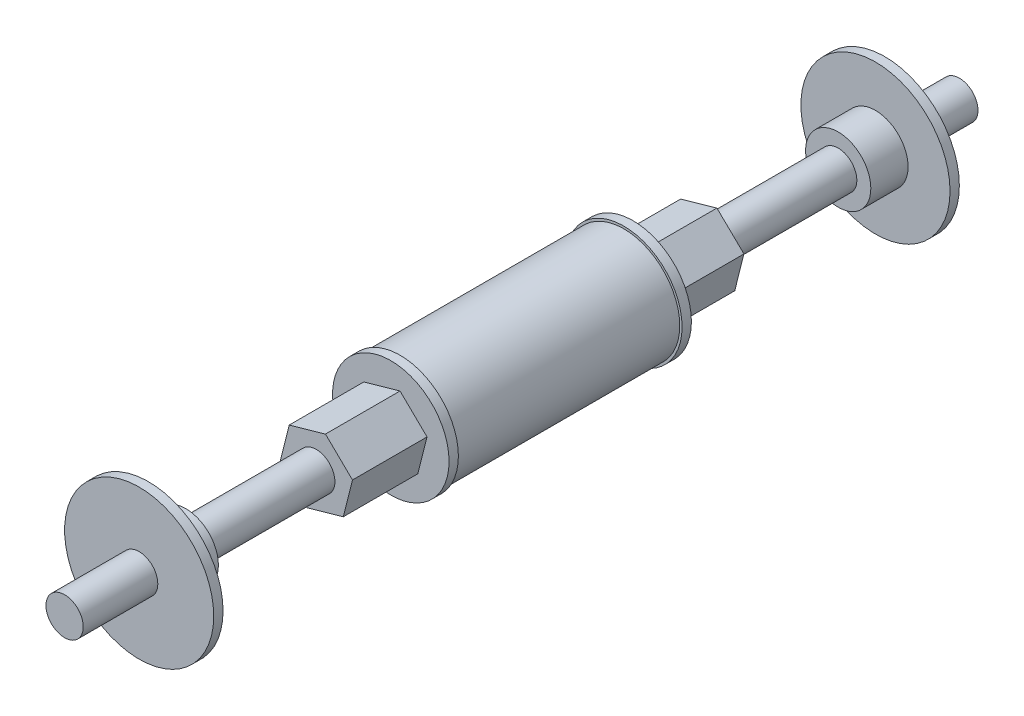
ISO-10303-21;
HEADER;
FILE_DESCRIPTION(('STEP AP214'),'2;1');
FILE_NAME('part.step','',(''),(''),'','','');
FILE_SCHEMA(('AUTOMOTIVE_DESIGN { 1 0 10303 214 1 1 1 1 }'));
ENDSEC;
DATA;
#1=APPLICATION_CONTEXT('core data for automotive mechanical design processes');
#2=APPLICATION_PROTOCOL_DEFINITION('international standard','automotive_design',2000,#1);
#3=PRODUCT_CONTEXT('',#1,'mechanical');
#4=PRODUCT('Part','Part','',(#3));
#5=PRODUCT_RELATED_PRODUCT_CATEGORY('part','',(#4));
#6=PRODUCT_DEFINITION_FORMATION('','',#4);
#7=PRODUCT_DEFINITION_CONTEXT('part definition',#1,'design');
#8=PRODUCT_DEFINITION('design','',#6,#7);
#9=PRODUCT_DEFINITION_SHAPE('','',#8);
#10=(LENGTH_UNIT() NAMED_UNIT(*) SI_UNIT(.MILLI.,.METRE.));
#11=(NAMED_UNIT(*) PLANE_ANGLE_UNIT() SI_UNIT($,.RADIAN.));
#12=(NAMED_UNIT(*) SI_UNIT($,.STERADIAN.) SOLID_ANGLE_UNIT());
#13=UNCERTAINTY_MEASURE_WITH_UNIT(LENGTH_MEASURE(1.E-05),#10,'distance_accuracy_value','');
#14=(GEOMETRIC_REPRESENTATION_CONTEXT(3) GLOBAL_UNCERTAINTY_ASSIGNED_CONTEXT((#13)) GLOBAL_UNIT_ASSIGNED_CONTEXT((#10,
#11,#12)) REPRESENTATION_CONTEXT('',''));
#15=CARTESIAN_POINT('',(0.,0.,0.));
#16=DIRECTION('',(0.,0.,1.));
#17=DIRECTION('',(1.,0.,0.));
#18=AXIS2_PLACEMENT_3D('',#15,#16,#17);
#19=CARTESIAN_POINT('',(0.,0.,-20.6375));
#20=DIRECTION('',(0.,0.,-1.));
#21=DIRECTION('',(1.,0.,0.));
#22=AXIS2_PLACEMENT_3D('',#19,#20,#21);
#23=PLANE('',#22);
#24=CARTESIAN_POINT('',(0.,0.,-20.6375));
#25=DIRECTION('',(0.,0.,1.));
#26=DIRECTION('',(1.,0.,0.));
#27=AXIS2_PLACEMENT_3D('',#24,#25,#26);
#28=CIRCLE('',#27,9.921875);
#29=CARTESIAN_POINT('',(9.921875,0.,-20.6375));
#30=VERTEX_POINT('',#29);
#31=EDGE_CURVE('E209',#30,#30,#28,.T.);
#32=ORIENTED_EDGE('',*,*,#31,.F.);
#33=EDGE_LOOP('',(#32));
#34=FACE_BOUND('',#33,.T.);
#35=DIRECTION('',(0.717469018062941,-0.696590416327844,0.));
#36=VECTOR('',#35,1.);
#37=CARTESIAN_POINT('',(-6.17200110950044,-1.75184314014087,-20.6375));
#38=LINE('',#37,#36);
#39=CARTESIAN_POINT('',(-6.17200110950044,-1.75184314014087,-20.6375));
#40=VERTEX_POINT('',#39);
#41=CARTESIAN_POINT('',(-1.56885989194273,-6.22103132308356,-20.6375));
#42=VERTEX_POINT('',#41);
#43=EDGE_CURVE('E177',#40,#42,#38,.T.);
#44=ORIENTED_EDGE('',*,*,#43,.T.);
#45=DIRECTION('',(0.961999505604162,0.273051187906861,0.));
#46=VECTOR('',#45,1.);
#47=CARTESIAN_POINT('',(-1.56885989194273,-6.22103132308356,-20.6375));
#48=LINE('',#47,#46);
#49=CARTESIAN_POINT('',(4.60314121755772,-4.46918818294269,-20.6375));
#50=VERTEX_POINT('',#49);
#51=EDGE_CURVE('E59',#42,#50,#48,.T.);
#52=ORIENTED_EDGE('',*,*,#51,.T.);
#53=DIRECTION('',(0.244530487541221,0.969641604234705,0.));
#54=VECTOR('',#53,1.);
#55=CARTESIAN_POINT('',(4.60314121755772,-4.46918818294269,-20.6375));
#56=LINE('',#55,#54);
#57=CARTESIAN_POINT('',(6.17200110950044,1.75184314014087,-20.6375));
#58=VERTEX_POINT('',#57);
#59=EDGE_CURVE('E154',#50,#58,#56,.T.);
#60=ORIENTED_EDGE('',*,*,#59,.T.);
#61=DIRECTION('',(-0.717469018062941,0.696590416327844,0.));
#62=VECTOR('',#61,1.);
#63=CARTESIAN_POINT('',(6.17200110950044,1.75184314014087,-20.6375));
#64=LINE('',#63,#62);
#65=CARTESIAN_POINT('',(1.56885989194273,6.22103132308356,-20.6375));
#66=VERTEX_POINT('',#65);
#67=EDGE_CURVE('E189',#58,#66,#64,.T.);
#68=ORIENTED_EDGE('',*,*,#67,.T.);
#69=DIRECTION('',(-0.961999505604162,-0.273051187906861,0.));
#70=VECTOR('',#69,1.);
#71=CARTESIAN_POINT('',(1.56885989194273,6.22103132308356,-20.6375));
#72=LINE('',#71,#70);
#73=CARTESIAN_POINT('',(-4.60314121755772,4.46918818294269,-20.6375));
#74=VERTEX_POINT('',#73);
#75=EDGE_CURVE('E185',#66,#74,#72,.T.);
#76=ORIENTED_EDGE('',*,*,#75,.T.);
#77=DIRECTION('',(-0.244530487541221,-0.969641604234705,0.));
#78=VECTOR('',#77,1.);
#79=CARTESIAN_POINT('',(-4.60314121755772,4.46918818294269,-20.6375));
#80=LINE('',#79,#78);
#81=EDGE_CURVE('E181',#74,#40,#80,.T.);
#82=ORIENTED_EDGE('',*,*,#81,.T.);
#83=EDGE_LOOP('',(#44,#52,#60,#68,#76,#82));
#84=FACE_BOUND('',#83,.T.);
#85=ADVANCED_FACE('F41',(#34,#84),#23,.T.);
#86=CARTESIAN_POINT('',(0.,0.,19.05));
#87=DIRECTION('',(0.,0.,-1.));
#88=DIRECTION('',(-1.,0.,0.));
#89=AXIS2_PLACEMENT_3D('',#86,#87,#88);
#90=CYLINDRICAL_SURFACE('',#89,9.525);
#91=CARTESIAN_POINT('',(0.,0.,19.05));
#92=DIRECTION('',(0.,0.,1.));
#93=DIRECTION('',(1.,0.,0.));
#94=AXIS2_PLACEMENT_3D('',#91,#92,#93);
#95=CIRCLE('',#94,9.525);
#96=CARTESIAN_POINT('',(9.525,0.,19.05));
#97=VERTEX_POINT('',#96);
#98=EDGE_CURVE('E45',#97,#97,#95,.T.);
#99=ORIENTED_EDGE('',*,*,#98,.F.);
#100=EDGE_LOOP('',(#99));
#101=FACE_BOUND('',#100,.T.);
#102=CARTESIAN_POINT('',(0.,0.,-19.05));
#103=DIRECTION('',(0.,0.,1.));
#104=DIRECTION('',(1.,0.,0.));
#105=AXIS2_PLACEMENT_3D('',#102,#103,#104);
#106=CIRCLE('',#105,9.525);
#107=CARTESIAN_POINT('',(9.525,0.,-19.05));
#108=VERTEX_POINT('',#107);
#109=EDGE_CURVE('E213',#108,#108,#106,.T.);
#110=ORIENTED_EDGE('',*,*,#109,.T.);
#111=EDGE_LOOP('',(#110));
#112=FACE_BOUND('',#111,.T.);
#113=ADVANCED_FACE('F43',(#101,#112),#90,.T.);
#114=CARTESIAN_POINT('',(0.,0.,20.6375));
#115=DIRECTION('',(0.,0.,-1.));
#116=DIRECTION('',(-1.,0.,0.));
#117=AXIS2_PLACEMENT_3D('',#114,#115,#116);
#118=CYLINDRICAL_SURFACE('',#117,9.921875);
#119=CARTESIAN_POINT('',(0.,0.,20.6375));
#120=DIRECTION('',(0.,0.,1.));
#121=DIRECTION('',(1.,0.,0.));
#122=AXIS2_PLACEMENT_3D('',#119,#120,#121);
#123=CIRCLE('',#122,9.921875);
#124=CARTESIAN_POINT('',(9.921875,0.,20.6375));
#125=VERTEX_POINT('',#124);
#126=EDGE_CURVE('E312',#125,#125,#123,.T.);
#127=ORIENTED_EDGE('',*,*,#126,.F.);
#128=EDGE_LOOP('',(#127));
#129=FACE_BOUND('',#128,.T.);
#130=CARTESIAN_POINT('',(0.,0.,19.05));
#131=DIRECTION('',(0.,0.,1.));
#132=DIRECTION('',(1.,0.,0.));
#133=AXIS2_PLACEMENT_3D('',#130,#131,#132);
#134=CIRCLE('',#133,9.921875);
#135=CARTESIAN_POINT('',(9.921875,0.,19.05));
#136=VERTEX_POINT('',#135);
#137=EDGE_CURVE('E311',#136,#136,#134,.T.);
#138=ORIENTED_EDGE('',*,*,#137,.T.);
#139=EDGE_LOOP('',(#138));
#140=FACE_BOUND('',#139,.T.);
#141=ADVANCED_FACE('F319',(#129,#140),#118,.T.);
#142=CARTESIAN_POINT('',(0.,0.,20.6375));
#143=DIRECTION('',(0.,0.,1.));
#144=DIRECTION('',(1.,0.,0.));
#145=AXIS2_PLACEMENT_3D('',#142,#143,#144);
#146=PLANE('',#145);
#147=DIRECTION('',(0.961999505604162,0.273051187906861,0.));
#148=VECTOR('',#147,1.);
#149=CARTESIAN_POINT('',(-1.56885989194273,-6.22103132308356,20.6375));
#150=LINE('',#149,#148);
#151=CARTESIAN_POINT('',(-1.56885989194273,-6.22103132308356,20.6375));
#152=VERTEX_POINT('',#151);
#153=CARTESIAN_POINT('',(4.60314121755772,-4.46918818294269,20.6375));
#154=VERTEX_POINT('',#153);
#155=EDGE_CURVE('E67',#152,#154,#150,.T.);
#156=ORIENTED_EDGE('',*,*,#155,.F.);
#157=DIRECTION('',(0.717469018062941,-0.696590416327844,0.));
#158=VECTOR('',#157,1.);
#159=CARTESIAN_POINT('',(-6.17200110950044,-1.75184314014087,20.6375));
#160=LINE('',#159,#158);
#161=CARTESIAN_POINT('',(-6.17200110950044,-1.75184314014087,20.6375));
#162=VERTEX_POINT('',#161);
#163=EDGE_CURVE('E252',#162,#152,#160,.T.);
#164=ORIENTED_EDGE('',*,*,#163,.F.);
#165=DIRECTION('',(-0.244530487541221,-0.969641604234705,0.));
#166=VECTOR('',#165,1.);
#167=CARTESIAN_POINT('',(-4.60314121755772,4.46918818294269,20.6375));
#168=LINE('',#167,#166);
#169=CARTESIAN_POINT('',(-4.60314121755772,4.46918818294269,20.6375));
#170=VERTEX_POINT('',#169);
#171=EDGE_CURVE('E282',#170,#162,#168,.T.);
#172=ORIENTED_EDGE('',*,*,#171,.F.);
#173=DIRECTION('',(-0.961999505604162,-0.273051187906861,0.));
#174=VECTOR('',#173,1.);
#175=CARTESIAN_POINT('',(1.56885989194273,6.22103132308356,20.6375));
#176=LINE('',#175,#174);
#177=CARTESIAN_POINT('',(1.56885989194273,6.22103132308356,20.6375));
#178=VERTEX_POINT('',#177);
#179=EDGE_CURVE('E278',#178,#170,#176,.T.);
#180=ORIENTED_EDGE('',*,*,#179,.F.);
#181=DIRECTION('',(-0.717469018062941,0.696590416327844,0.));
#182=VECTOR('',#181,1.);
#183=CARTESIAN_POINT('',(6.17200110950044,1.75184314014087,20.6375));
#184=LINE('',#183,#182);
#185=CARTESIAN_POINT('',(6.17200110950044,1.75184314014087,20.6375));
#186=VERTEX_POINT('',#185);
#187=EDGE_CURVE('E274',#186,#178,#184,.T.);
#188=ORIENTED_EDGE('',*,*,#187,.F.);
#189=DIRECTION('',(0.244530487541221,0.969641604234705,0.));
#190=VECTOR('',#189,1.);
#191=CARTESIAN_POINT('',(4.60314121755772,-4.46918818294269,20.6375));
#192=LINE('',#191,#190);
#193=EDGE_CURVE('E270',#154,#186,#192,.T.);
#194=ORIENTED_EDGE('',*,*,#193,.F.);
#195=EDGE_LOOP('',(#156,#164,#172,#180,#188,#194));
#196=FACE_BOUND('',#195,.T.);
#197=ORIENTED_EDGE('',*,*,#126,.T.);
#198=EDGE_LOOP('',(#197));
#199=FACE_BOUND('',#198,.T.);
#200=ADVANCED_FACE('F324',(#196,#199),#146,.T.);
#201=CARTESIAN_POINT('',(0.,0.,19.05));
#202=DIRECTION('',(0.,0.,1.));
#203=DIRECTION('',(1.,0.,0.));
#204=AXIS2_PLACEMENT_3D('',#201,#202,#203);
#205=PLANE('',#204);
#206=ORIENTED_EDGE('',*,*,#98,.T.);
#207=EDGE_LOOP('',(#206));
#208=FACE_BOUND('',#207,.T.);
#209=ORIENTED_EDGE('',*,*,#137,.F.);
#210=EDGE_LOOP('',(#209));
#211=FACE_BOUND('',#210,.T.);
#212=ADVANCED_FACE('F321',(#208,#211),#205,.F.);
#213=CARTESIAN_POINT('',(-1.56885989194273,-6.22103132308356,33.3375));
#214=DIRECTION('',(-0.273051187906861,0.961999505604162,0.));
#215=DIRECTION('',(-0.961999505604162,-0.273051187906861,0.));
#216=AXIS2_PLACEMENT_3D('',#213,#214,#215);
#217=PLANE('',#216);
#218=ORIENTED_EDGE('',*,*,#155,.T.);
#219=DIRECTION('',(0.,0.,-1.));
#220=VECTOR('',#219,1.);
#221=CARTESIAN_POINT('',(4.60314121755772,-4.46918818294269,33.3375));
#222=LINE('',#221,#220);
#223=CARTESIAN_POINT('',(4.60314121755772,-4.46918818294269,33.3375));
#224=VERTEX_POINT('',#223);
#225=EDGE_CURVE('E307',#224,#154,#222,.T.);
#226=ORIENTED_EDGE('',*,*,#225,.F.);
#227=DIRECTION('',(0.961999505604162,0.273051187906861,0.));
#228=VECTOR('',#227,1.);
#229=CARTESIAN_POINT('',(-1.56885989194273,-6.22103132308356,33.3375));
#230=LINE('',#229,#228);
#231=CARTESIAN_POINT('',(-1.56885989194273,-6.22103132308356,33.3375));
#232=VERTEX_POINT('',#231);
#233=EDGE_CURVE('E247',#232,#224,#230,.T.);
#234=ORIENTED_EDGE('',*,*,#233,.F.);
#235=DIRECTION('',(0.,0.,-1.));
#236=VECTOR('',#235,1.);
#237=CARTESIAN_POINT('',(-1.56885989194273,-6.22103132308356,33.3375));
#238=LINE('',#237,#236);
#239=EDGE_CURVE('E267',#232,#152,#238,.T.);
#240=ORIENTED_EDGE('',*,*,#239,.T.);
#241=EDGE_LOOP('',(#218,#226,#234,#240));
#242=FACE_BOUND('',#241,.T.);
#243=ADVANCED_FACE('F323',(#242),#217,.F.);
#244=CARTESIAN_POINT('',(4.60314121755772,-4.46918818294269,33.3375));
#245=DIRECTION('',(-0.969641604234705,0.244530487541221,0.));
#246=DIRECTION('',(-0.244530487541221,-0.969641604234705,0.));
#247=AXIS2_PLACEMENT_3D('',#244,#245,#246);
#248=PLANE('',#247);
#249=ORIENTED_EDGE('',*,*,#193,.T.);
#250=DIRECTION('',(0.,0.,-1.));
#251=VECTOR('',#250,1.);
#252=CARTESIAN_POINT('',(6.17200110950044,1.75184314014087,33.3375));
#253=LINE('',#252,#251);
#254=CARTESIAN_POINT('',(6.17200110950044,1.75184314014087,33.3375));
#255=VERTEX_POINT('',#254);
#256=EDGE_CURVE('E303',#255,#186,#253,.T.);
#257=ORIENTED_EDGE('',*,*,#256,.F.);
#258=DIRECTION('',(0.244530487541221,0.969641604234705,0.));
#259=VECTOR('',#258,1.);
#260=CARTESIAN_POINT('',(4.60314121755772,-4.46918818294269,33.3375));
#261=LINE('',#260,#259);
#262=EDGE_CURVE('E251',#224,#255,#261,.T.);
#263=ORIENTED_EDGE('',*,*,#262,.F.);
#264=ORIENTED_EDGE('',*,*,#225,.T.);
#265=EDGE_LOOP('',(#249,#257,#263,#264));
#266=FACE_BOUND('',#265,.T.);
#267=ADVANCED_FACE('F331',(#266),#248,.F.);
#268=CARTESIAN_POINT('',(6.17200110950044,1.75184314014087,33.3375));
#269=DIRECTION('',(-0.696590416327844,-0.717469018062941,0.));
#270=DIRECTION('',(0.717469018062941,-0.696590416327844,0.));
#271=AXIS2_PLACEMENT_3D('',#268,#269,#270);
#272=PLANE('',#271);
#273=ORIENTED_EDGE('',*,*,#187,.T.);
#274=DIRECTION('',(0.,0.,-1.));
#275=VECTOR('',#274,1.);
#276=CARTESIAN_POINT('',(1.56885989194273,6.22103132308356,33.3375));
#277=LINE('',#276,#275);
#278=CARTESIAN_POINT('',(1.56885989194273,6.22103132308356,33.3375));
#279=VERTEX_POINT('',#278);
#280=EDGE_CURVE('E299',#279,#178,#277,.T.);
#281=ORIENTED_EDGE('',*,*,#280,.F.);
#282=DIRECTION('',(-0.717469018062941,0.696590416327844,0.));
#283=VECTOR('',#282,1.);
#284=CARTESIAN_POINT('',(6.17200110950044,1.75184314014087,33.3375));
#285=LINE('',#284,#283);
#286=EDGE_CURVE('E255',#255,#279,#285,.T.);
#287=ORIENTED_EDGE('',*,*,#286,.F.);
#288=ORIENTED_EDGE('',*,*,#256,.T.);
#289=EDGE_LOOP('',(#273,#281,#287,#288));
#290=FACE_BOUND('',#289,.T.);
#291=ADVANCED_FACE('F403',(#290),#272,.F.);
#292=CARTESIAN_POINT('',(1.56885989194273,6.22103132308356,33.3375));
#293=DIRECTION('',(0.273051187906861,-0.961999505604162,0.));
#294=DIRECTION('',(0.961999505604162,0.273051187906861,0.));
#295=AXIS2_PLACEMENT_3D('',#292,#293,#294);
#296=PLANE('',#295);
#297=ORIENTED_EDGE('',*,*,#179,.T.);
#298=DIRECTION('',(0.,0.,-1.));
#299=VECTOR('',#298,1.);
#300=CARTESIAN_POINT('',(-4.60314121755772,4.46918818294269,33.3375));
#301=LINE('',#300,#299);
#302=CARTESIAN_POINT('',(-4.60314121755772,4.46918818294269,33.3375));
#303=VERTEX_POINT('',#302);
#304=EDGE_CURVE('E295',#303,#170,#301,.T.);
#305=ORIENTED_EDGE('',*,*,#304,.F.);
#306=DIRECTION('',(-0.961999505604162,-0.273051187906861,0.));
#307=VECTOR('',#306,1.);
#308=CARTESIAN_POINT('',(1.56885989194273,6.22103132308356,33.3375));
#309=LINE('',#308,#307);
#310=EDGE_CURVE('E258',#279,#303,#309,.T.);
#311=ORIENTED_EDGE('',*,*,#310,.F.);
#312=ORIENTED_EDGE('',*,*,#280,.T.);
#313=EDGE_LOOP('',(#297,#305,#311,#312));
#314=FACE_BOUND('',#313,.T.);
#315=ADVANCED_FACE('F399',(#314),#296,.F.);
#316=CARTESIAN_POINT('',(-4.60314121755772,4.46918818294269,33.3375));
#317=DIRECTION('',(0.969641604234705,-0.244530487541221,0.));
#318=DIRECTION('',(0.244530487541221,0.969641604234705,0.));
#319=AXIS2_PLACEMENT_3D('',#316,#317,#318);
#320=PLANE('',#319);
#321=ORIENTED_EDGE('',*,*,#171,.T.);
#322=DIRECTION('',(0.,0.,-1.));
#323=VECTOR('',#322,1.);
#324=CARTESIAN_POINT('',(-6.17200110950044,-1.75184314014087,33.3375));
#325=LINE('',#324,#323);
#326=CARTESIAN_POINT('',(-6.17200110950044,-1.75184314014087,33.3375));
#327=VERTEX_POINT('',#326);
#328=EDGE_CURVE('E291',#327,#162,#325,.T.);
#329=ORIENTED_EDGE('',*,*,#328,.F.);
#330=DIRECTION('',(-0.244530487541221,-0.969641604234705,0.));
#331=VECTOR('',#330,1.);
#332=CARTESIAN_POINT('',(-4.60314121755772,4.46918818294269,33.3375));
#333=LINE('',#332,#331);
#334=EDGE_CURVE('E261',#303,#327,#333,.T.);
#335=ORIENTED_EDGE('',*,*,#334,.F.);
#336=ORIENTED_EDGE('',*,*,#304,.T.);
#337=EDGE_LOOP('',(#321,#329,#335,#336));
#338=FACE_BOUND('',#337,.T.);
#339=ADVANCED_FACE('F395',(#338),#320,.F.);
#340=CARTESIAN_POINT('',(-6.17200110950044,-1.75184314014087,33.3375));
#341=DIRECTION('',(0.696590416327844,0.717469018062941,0.));
#342=DIRECTION('',(-0.717469018062941,0.696590416327844,0.));
#343=AXIS2_PLACEMENT_3D('',#340,#341,#342);
#344=PLANE('',#343);
#345=ORIENTED_EDGE('',*,*,#163,.T.);
#346=ORIENTED_EDGE('',*,*,#239,.F.);
#347=DIRECTION('',(0.717469018062941,-0.696590416327844,0.));
#348=VECTOR('',#347,1.);
#349=CARTESIAN_POINT('',(-6.17200110950044,-1.75184314014087,33.3375));
#350=LINE('',#349,#348);
#351=EDGE_CURVE('E264',#327,#232,#350,.T.);
#352=ORIENTED_EDGE('',*,*,#351,.F.);
#353=ORIENTED_EDGE('',*,*,#328,.T.);
#354=EDGE_LOOP('',(#345,#346,#352,#353));
#355=FACE_BOUND('',#354,.T.);
#356=ADVANCED_FACE('F391',(#355),#344,.F.);
#357=CARTESIAN_POINT('',(0.,0.,33.3375));
#358=DIRECTION('',(0.,0.,1.));
#359=DIRECTION('',(1.,0.,0.));
#360=AXIS2_PLACEMENT_3D('',#357,#358,#359);
#361=PLANE('',#360);
#362=CARTESIAN_POINT('',(0.,0.,33.3375));
#363=DIRECTION('',(0.,0.,1.));
#364=DIRECTION('',(1.,0.,0.));
#365=AXIS2_PLACEMENT_3D('',#362,#363,#364);
#366=CIRCLE('',#365,3.175);
#367=CARTESIAN_POINT('',(3.175,0.,33.3375));
#368=VERTEX_POINT('',#367);
#369=EDGE_CURVE('E51',#368,#368,#366,.T.);
#370=ORIENTED_EDGE('',*,*,#369,.F.);
#371=EDGE_LOOP('',(#370));
#372=FACE_BOUND('',#371,.T.);
#373=ORIENTED_EDGE('',*,*,#233,.T.);
#374=ORIENTED_EDGE('',*,*,#262,.T.);
#375=ORIENTED_EDGE('',*,*,#286,.T.);
#376=ORIENTED_EDGE('',*,*,#310,.T.);
#377=ORIENTED_EDGE('',*,*,#334,.T.);
#378=ORIENTED_EDGE('',*,*,#351,.T.);
#379=EDGE_LOOP('',(#373,#374,#375,#376,#377,#378));
#380=FACE_BOUND('',#379,.T.);
#381=ADVANCED_FACE('F387',(#372,#380),#361,.T.);
#382=CARTESIAN_POINT('',(0.,0.,55.5625));
#383=DIRECTION('',(0.,0.,-1.));
#384=DIRECTION('',(-1.,0.,0.));
#385=AXIS2_PLACEMENT_3D('',#382,#383,#384);
#386=CYLINDRICAL_SURFACE('',#385,3.175);
#387=CARTESIAN_POINT('',(0.,0.,55.5625));
#388=DIRECTION('',(0.,0.,1.));
#389=DIRECTION('',(1.,0.,0.));
#390=AXIS2_PLACEMENT_3D('',#387,#388,#389);
#391=CIRCLE('',#390,3.175);
#392=CARTESIAN_POINT('',(3.175,0.,55.5625));
#393=VERTEX_POINT('',#392);
#394=EDGE_CURVE('E237',#393,#393,#391,.T.);
#395=ORIENTED_EDGE('',*,*,#394,.F.);
#396=EDGE_LOOP('',(#395));
#397=FACE_BOUND('',#396,.T.);
#398=ORIENTED_EDGE('',*,*,#369,.T.);
#399=EDGE_LOOP('',(#398));
#400=FACE_BOUND('',#399,.T.);
#401=ADVANCED_FACE('F383',(#397,#400),#386,.T.);
#402=CARTESIAN_POINT('',(0.,0.,61.9125));
#403=DIRECTION('',(0.,0.,-1.));
#404=DIRECTION('',(-1.,0.,0.));
#405=AXIS2_PLACEMENT_3D('',#402,#403,#404);
#406=CYLINDRICAL_SURFACE('',#405,5.55625);
#407=CARTESIAN_POINT('',(0.,0.,61.9125));
#408=DIRECTION('',(0.,0.,1.));
#409=DIRECTION('',(1.,0.,0.));
#410=AXIS2_PLACEMENT_3D('',#407,#408,#409);
#411=CIRCLE('',#410,5.55625);
#412=CARTESIAN_POINT('',(5.55625,0.,61.9125));
#413=VERTEX_POINT('',#412);
#414=EDGE_CURVE('E233',#413,#413,#411,.T.);
#415=ORIENTED_EDGE('',*,*,#414,.F.);
#416=EDGE_LOOP('',(#415));
#417=FACE_BOUND('',#416,.T.);
#418=CARTESIAN_POINT('',(0.,0.,55.5625));
#419=DIRECTION('',(0.,0.,1.));
#420=DIRECTION('',(1.,0.,0.));
#421=AXIS2_PLACEMENT_3D('',#418,#419,#420);
#422=CIRCLE('',#421,5.55625);
#423=CARTESIAN_POINT('',(5.55625,0.,55.5625));
#424=VERTEX_POINT('',#423);
#425=EDGE_CURVE('E229',#424,#424,#422,.T.);
#426=ORIENTED_EDGE('',*,*,#425,.T.);
#427=EDGE_LOOP('',(#426));
#428=FACE_BOUND('',#427,.T.);
#429=ADVANCED_FACE('F379',(#417,#428),#406,.T.);
#430=CARTESIAN_POINT('',(0.,0.,55.5625));
#431=DIRECTION('',(0.,0.,1.));
#432=DIRECTION('',(1.,0.,0.));
#433=AXIS2_PLACEMENT_3D('',#430,#431,#432);
#434=PLANE('',#433);
#435=ORIENTED_EDGE('',*,*,#394,.T.);
#436=EDGE_LOOP('',(#435));
#437=FACE_BOUND('',#436,.T.);
#438=ORIENTED_EDGE('',*,*,#425,.F.);
#439=EDGE_LOOP('',(#438));
#440=FACE_BOUND('',#439,.T.);
#441=ADVANCED_FACE('F375',(#437,#440),#434,.F.);
#442=CARTESIAN_POINT('',(0.,0.,63.5));
#443=DIRECTION('',(0.,0.,-1.));
#444=DIRECTION('',(-1.,0.,0.));
#445=AXIS2_PLACEMENT_3D('',#442,#443,#444);
#446=CYLINDRICAL_SURFACE('',#445,12.7);
#447=CARTESIAN_POINT('',(0.,0.,63.5));
#448=DIRECTION('',(0.,0.,1.));
#449=DIRECTION('',(1.,0.,0.));
#450=AXIS2_PLACEMENT_3D('',#447,#448,#449);
#451=CIRCLE('',#450,12.7);
#452=CARTESIAN_POINT('',(12.7,0.,63.5));
#453=VERTEX_POINT('',#452);
#454=EDGE_CURVE('E225',#453,#453,#451,.T.);
#455=ORIENTED_EDGE('',*,*,#454,.F.);
#456=EDGE_LOOP('',(#455));
#457=FACE_BOUND('',#456,.T.);
#458=CARTESIAN_POINT('',(0.,0.,61.9125));
#459=DIRECTION('',(0.,0.,1.));
#460=DIRECTION('',(1.,0.,0.));
#461=AXIS2_PLACEMENT_3D('',#458,#459,#460);
#462=CIRCLE('',#461,12.7);
#463=CARTESIAN_POINT('',(12.7,0.,61.9125));
#464=VERTEX_POINT('',#463);
#465=EDGE_CURVE('E223',#464,#464,#462,.T.);
#466=ORIENTED_EDGE('',*,*,#465,.T.);
#467=EDGE_LOOP('',(#466));
#468=FACE_BOUND('',#467,.T.);
#469=ADVANCED_FACE('F368',(#457,#468),#446,.T.);
#470=CARTESIAN_POINT('',(0.,0.,63.5));
#471=DIRECTION('',(0.,0.,1.));
#472=DIRECTION('',(1.,0.,0.));
#473=AXIS2_PLACEMENT_3D('',#470,#471,#472);
#474=PLANE('',#473);
#475=CARTESIAN_POINT('',(0.,0.,63.5));
#476=DIRECTION('',(0.,0.,1.));
#477=DIRECTION('',(1.,0.,0.));
#478=AXIS2_PLACEMENT_3D('',#475,#476,#477);
#479=CIRCLE('',#478,3.175);
#480=CARTESIAN_POINT('',(3.175,0.,63.5));
#481=VERTEX_POINT('',#480);
#482=EDGE_CURVE('E11',#481,#481,#479,.T.);
#483=ORIENTED_EDGE('',*,*,#482,.F.);
#484=EDGE_LOOP('',(#483));
#485=FACE_BOUND('',#484,.T.);
#486=ORIENTED_EDGE('',*,*,#454,.T.);
#487=EDGE_LOOP('',(#486));
#488=FACE_BOUND('',#487,.T.);
#489=ADVANCED_FACE('F365',(#485,#488),#474,.T.);
#490=CARTESIAN_POINT('',(0.,0.,61.9125));
#491=DIRECTION('',(0.,0.,1.));
#492=DIRECTION('',(1.,0.,0.));
#493=AXIS2_PLACEMENT_3D('',#490,#491,#492);
#494=PLANE('',#493);
#495=ORIENTED_EDGE('',*,*,#414,.T.);
#496=EDGE_LOOP('',(#495));
#497=FACE_BOUND('',#496,.T.);
#498=ORIENTED_EDGE('',*,*,#465,.F.);
#499=EDGE_LOOP('',(#498));
#500=FACE_BOUND('',#499,.T.);
#501=ADVANCED_FACE('F363',(#497,#500),#494,.F.);
#502=CARTESIAN_POINT('',(0.,0.,76.2));
#503=DIRECTION('',(0.,0.,-1.));
#504=DIRECTION('',(-1.,0.,0.));
#505=AXIS2_PLACEMENT_3D('',#502,#503,#504);
#506=CYLINDRICAL_SURFACE('',#505,3.175);
#507=CARTESIAN_POINT('',(0.,0.,76.2));
#508=DIRECTION('',(0.,0.,1.));
#509=DIRECTION('',(1.,0.,0.));
#510=AXIS2_PLACEMENT_3D('',#507,#508,#509);
#511=CIRCLE('',#510,3.175);
#512=CARTESIAN_POINT('',(3.175,0.,76.2));
#513=VERTEX_POINT('',#512);
#514=EDGE_CURVE('E220',#513,#513,#511,.T.);
#515=ORIENTED_EDGE('',*,*,#514,.F.);
#516=EDGE_LOOP('',(#515));
#517=FACE_BOUND('',#516,.T.);
#518=ORIENTED_EDGE('',*,*,#482,.T.);
#519=EDGE_LOOP('',(#518));
#520=FACE_BOUND('',#519,.T.);
#521=ADVANCED_FACE('F359',(#517,#520),#506,.T.);
#522=CARTESIAN_POINT('',(0.,0.,76.2));
#523=DIRECTION('',(0.,0.,1.));
#524=DIRECTION('',(1.,0.,0.));
#525=AXIS2_PLACEMENT_3D('',#522,#523,#524);
#526=PLANE('',#525);
#527=ORIENTED_EDGE('',*,*,#514,.T.);
#528=EDGE_LOOP('',(#527));
#529=FACE_BOUND('',#528,.T.);
#530=ADVANCED_FACE('F355',(#529),#526,.T.);
#531=CARTESIAN_POINT('',(0.,0.,-20.6375));
#532=DIRECTION('',(0.,0.,1.));
#533=DIRECTION('',(1.,0.,0.));
#534=AXIS2_PLACEMENT_3D('',#531,#532,#533);
#535=CYLINDRICAL_SURFACE('',#534,9.921875);
#536=ORIENTED_EDGE('',*,*,#31,.T.);
#537=EDGE_LOOP('',(#536));
#538=FACE_BOUND('',#537,.T.);
#539=CARTESIAN_POINT('',(0.,0.,-19.05));
#540=DIRECTION('',(0.,0.,1.));
#541=DIRECTION('',(1.,0.,0.));
#542=AXIS2_PLACEMENT_3D('',#539,#540,#541);
#543=CIRCLE('',#542,9.921875);
#544=CARTESIAN_POINT('',(9.921875,0.,-19.05));
#545=VERTEX_POINT('',#544);
#546=EDGE_CURVE('E141',#545,#545,#543,.T.);
#547=ORIENTED_EDGE('',*,*,#546,.F.);
#548=EDGE_LOOP('',(#547));
#549=FACE_BOUND('',#548,.T.);
#550=ADVANCED_FACE('F351',(#538,#549),#535,.T.);
#551=CARTESIAN_POINT('',(0.,0.,-19.05));
#552=DIRECTION('',(0.,0.,-1.));
#553=DIRECTION('',(1.,0.,0.));
#554=AXIS2_PLACEMENT_3D('',#551,#552,#553);
#555=PLANE('',#554);
#556=ORIENTED_EDGE('',*,*,#109,.F.);
#557=EDGE_LOOP('',(#556));
#558=FACE_BOUND('',#557,.T.);
#559=ORIENTED_EDGE('',*,*,#546,.T.);
#560=EDGE_LOOP('',(#559));
#561=FACE_BOUND('',#560,.T.);
#562=ADVANCED_FACE('F348',(#558,#561),#555,.F.);
#563=CARTESIAN_POINT('',(-1.56885989194273,-6.22103132308356,-33.3375));
#564=DIRECTION('',(0.273051187906861,-0.961999505604162,0.));
#565=DIRECTION('',(0.961999505604162,0.273051187906861,0.));
#566=AXIS2_PLACEMENT_3D('',#563,#564,#565);
#567=PLANE('',#566);
#568=ORIENTED_EDGE('',*,*,#51,.F.);
#569=DIRECTION('',(0.,0.,1.));
#570=VECTOR('',#569,1.);
#571=CARTESIAN_POINT('',(-1.56885989194273,-6.22103132308356,-33.3375));
#572=LINE('',#571,#570);
#573=CARTESIAN_POINT('',(-1.56885989194273,-6.22103132308356,-33.3375));
#574=VERTEX_POINT('',#573);
#575=EDGE_CURVE('E131',#574,#42,#572,.T.);
#576=ORIENTED_EDGE('',*,*,#575,.F.);
#577=DIRECTION('',(0.961999505604162,0.273051187906861,0.));
#578=VECTOR('',#577,1.);
#579=CARTESIAN_POINT('',(-1.56885989194273,-6.22103132308356,-33.3375));
#580=LINE('',#579,#578);
#581=CARTESIAN_POINT('',(4.60314121755772,-4.46918818294269,-33.3375));
#582=VERTEX_POINT('',#581);
#583=EDGE_CURVE('E134',#574,#582,#580,.T.);
#584=ORIENTED_EDGE('',*,*,#583,.T.);
#585=DIRECTION('',(0.,0.,1.));
#586=VECTOR('',#585,1.);
#587=CARTESIAN_POINT('',(4.60314121755772,-4.46918818294269,-33.3375));
#588=LINE('',#587,#586);
#589=EDGE_CURVE('E174',#582,#50,#588,.T.);
#590=ORIENTED_EDGE('',*,*,#589,.T.);
#591=EDGE_LOOP('',(#568,#576,#584,#590));
#592=FACE_BOUND('',#591,.T.);
#593=ADVANCED_FACE('F133',(#592),#567,.T.);
#594=CARTESIAN_POINT('',(-6.17200110950044,-1.75184314014087,-33.3375));
#595=DIRECTION('',(-0.696590416327844,-0.717469018062941,0.));
#596=DIRECTION('',(0.717469018062941,-0.696590416327844,0.));
#597=AXIS2_PLACEMENT_3D('',#594,#595,#596);
#598=PLANE('',#597);
#599=ORIENTED_EDGE('',*,*,#43,.F.);
#600=DIRECTION('',(0.,0.,1.));
#601=VECTOR('',#600,1.);
#602=CARTESIAN_POINT('',(-6.17200110950044,-1.75184314014087,-33.3375));
#603=LINE('',#602,#601);
#604=CARTESIAN_POINT('',(-6.17200110950044,-1.75184314014087,-33.3375));
#605=VERTEX_POINT('',#604);
#606=EDGE_CURVE('E142',#605,#40,#603,.T.);
#607=ORIENTED_EDGE('',*,*,#606,.F.);
#608=DIRECTION('',(0.717469018062941,-0.696590416327844,0.));
#609=VECTOR('',#608,1.);
#610=CARTESIAN_POINT('',(-6.17200110950044,-1.75184314014087,-33.3375));
#611=LINE('',#610,#609);
#612=EDGE_CURVE('E148',#605,#574,#611,.T.);
#613=ORIENTED_EDGE('',*,*,#612,.T.);
#614=ORIENTED_EDGE('',*,*,#575,.T.);
#615=EDGE_LOOP('',(#599,#607,#613,#614));
#616=FACE_BOUND('',#615,.T.);
#617=ADVANCED_FACE('F156',(#616),#598,.T.);
#618=CARTESIAN_POINT('',(-4.60314121755772,4.46918818294269,-33.3375));
#619=DIRECTION('',(-0.969641604234705,0.244530487541221,0.));
#620=DIRECTION('',(-0.244530487541221,-0.969641604234705,0.));
#621=AXIS2_PLACEMENT_3D('',#618,#619,#620);
#622=PLANE('',#621);
#623=ORIENTED_EDGE('',*,*,#81,.F.);
#624=DIRECTION('',(0.,0.,1.));
#625=VECTOR('',#624,1.);
#626=CARTESIAN_POINT('',(-4.60314121755772,4.46918818294269,-33.3375));
#627=LINE('',#626,#625);
#628=CARTESIAN_POINT('',(-4.60314121755772,4.46918818294269,-33.3375));
#629=VERTEX_POINT('',#628);
#630=EDGE_CURVE('E204',#629,#74,#627,.T.);
#631=ORIENTED_EDGE('',*,*,#630,.F.);
#632=DIRECTION('',(-0.244530487541221,-0.969641604234705,0.));
#633=VECTOR('',#632,1.);
#634=CARTESIAN_POINT('',(-4.60314121755772,4.46918818294269,-33.3375));
#635=LINE('',#634,#633);
#636=EDGE_CURVE('E158',#629,#605,#635,.T.);
#637=ORIENTED_EDGE('',*,*,#636,.T.);
#638=ORIENTED_EDGE('',*,*,#606,.T.);
#639=EDGE_LOOP('',(#623,#631,#637,#638));
#640=FACE_BOUND('',#639,.T.);
#641=ADVANCED_FACE('F568',(#640),#622,.T.);
#642=CARTESIAN_POINT('',(1.56885989194273,6.22103132308356,-33.3375));
#643=DIRECTION('',(-0.273051187906861,0.961999505604162,0.));
#644=DIRECTION('',(-0.961999505604162,-0.273051187906861,0.));
#645=AXIS2_PLACEMENT_3D('',#642,#643,#644);
#646=PLANE('',#645);
#647=ORIENTED_EDGE('',*,*,#75,.F.);
#648=DIRECTION('',(0.,0.,1.));
#649=VECTOR('',#648,1.);
#650=CARTESIAN_POINT('',(1.56885989194273,6.22103132308356,-33.3375));
#651=LINE('',#650,#649);
#652=CARTESIAN_POINT('',(1.56885989194273,6.22103132308356,-33.3375));
#653=VERTEX_POINT('',#652);
#654=EDGE_CURVE('E201',#653,#66,#651,.T.);
#655=ORIENTED_EDGE('',*,*,#654,.F.);
#656=DIRECTION('',(-0.961999505604162,-0.273051187906861,0.));
#657=VECTOR('',#656,1.);
#658=CARTESIAN_POINT('',(1.56885989194273,6.22103132308356,-33.3375));
#659=LINE('',#658,#657);
#660=EDGE_CURVE('E161',#653,#629,#659,.T.);
#661=ORIENTED_EDGE('',*,*,#660,.T.);
#662=ORIENTED_EDGE('',*,*,#630,.T.);
#663=EDGE_LOOP('',(#647,#655,#661,#662));
#664=FACE_BOUND('',#663,.T.);
#665=ADVANCED_FACE('F576',(#664),#646,.T.);
#666=CARTESIAN_POINT('',(6.17200110950044,1.75184314014087,-33.3375));
#667=DIRECTION('',(0.696590416327844,0.717469018062941,0.));
#668=DIRECTION('',(-0.717469018062941,0.696590416327844,0.));
#669=AXIS2_PLACEMENT_3D('',#666,#667,#668);
#670=PLANE('',#669);
#671=ORIENTED_EDGE('',*,*,#67,.F.);
#672=DIRECTION('',(0.,0.,1.));
#673=VECTOR('',#672,1.);
#674=CARTESIAN_POINT('',(6.17200110950044,1.75184314014087,-33.3375));
#675=LINE('',#674,#673);
#676=CARTESIAN_POINT('',(6.17200110950044,1.75184314014087,-33.3375));
#677=VERTEX_POINT('',#676);
#678=EDGE_CURVE('E198',#677,#58,#675,.T.);
#679=ORIENTED_EDGE('',*,*,#678,.F.);
#680=DIRECTION('',(-0.717469018062941,0.696590416327844,0.));
#681=VECTOR('',#680,1.);
#682=CARTESIAN_POINT('',(6.17200110950044,1.75184314014087,-33.3375));
#683=LINE('',#682,#681);
#684=EDGE_CURVE('E168',#677,#653,#683,.T.);
#685=ORIENTED_EDGE('',*,*,#684,.T.);
#686=ORIENTED_EDGE('',*,*,#654,.T.);
#687=EDGE_LOOP('',(#671,#679,#685,#686));
#688=FACE_BOUND('',#687,.T.);
#689=ADVANCED_FACE('F586',(#688),#670,.T.);
#690=CARTESIAN_POINT('',(4.60314121755772,-4.46918818294269,-33.3375));
#691=DIRECTION('',(0.969641604234705,-0.244530487541221,0.));
#692=DIRECTION('',(0.244530487541221,0.969641604234705,0.));
#693=AXIS2_PLACEMENT_3D('',#690,#691,#692);
#694=PLANE('',#693);
#695=ORIENTED_EDGE('',*,*,#59,.F.);
#696=ORIENTED_EDGE('',*,*,#589,.F.);
#697=DIRECTION('',(0.244530487541221,0.969641604234705,0.));
#698=VECTOR('',#697,1.);
#699=CARTESIAN_POINT('',(4.60314121755772,-4.46918818294269,-33.3375));
#700=LINE('',#699,#698);
#701=EDGE_CURVE('E152',#582,#677,#700,.T.);
#702=ORIENTED_EDGE('',*,*,#701,.T.);
#703=ORIENTED_EDGE('',*,*,#678,.T.);
#704=EDGE_LOOP('',(#695,#696,#702,#703));
#705=FACE_BOUND('',#704,.T.);
#706=ADVANCED_FACE('F596',(#705),#694,.T.);
#707=CARTESIAN_POINT('',(0.,0.,-33.3375));
#708=DIRECTION('',(0.,0.,-1.));
#709=DIRECTION('',(1.,0.,0.));
#710=AXIS2_PLACEMENT_3D('',#707,#708,#709);
#711=PLANE('',#710);
#712=CARTESIAN_POINT('',(0.,0.,-33.3375));
#713=DIRECTION('',(0.,0.,1.));
#714=DIRECTION('',(1.,0.,0.));
#715=AXIS2_PLACEMENT_3D('',#712,#713,#714);
#716=CIRCLE('',#715,3.175);
#717=CARTESIAN_POINT('',(3.175,0.,-33.3375));
#718=VERTEX_POINT('',#717);
#719=EDGE_CURVE('E178',#718,#718,#716,.T.);
#720=ORIENTED_EDGE('',*,*,#719,.T.);
#721=EDGE_LOOP('',(#720));
#722=FACE_BOUND('',#721,.T.);
#723=ORIENTED_EDGE('',*,*,#583,.F.);
#724=ORIENTED_EDGE('',*,*,#612,.F.);
#725=ORIENTED_EDGE('',*,*,#636,.F.);
#726=ORIENTED_EDGE('',*,*,#660,.F.);
#727=ORIENTED_EDGE('',*,*,#684,.F.);
#728=ORIENTED_EDGE('',*,*,#701,.F.);
#729=EDGE_LOOP('',(#723,#724,#725,#726,#727,#728));
#730=FACE_BOUND('',#729,.T.);
#731=ADVANCED_FACE('F146',(#722,#730),#711,.T.);
#732=CARTESIAN_POINT('',(0.,0.,-55.5625));
#733=DIRECTION('',(0.,0.,1.));
#734=DIRECTION('',(1.,0.,0.));
#735=AXIS2_PLACEMENT_3D('',#732,#733,#734);
#736=CYLINDRICAL_SURFACE('',#735,3.175);
#737=CARTESIAN_POINT('',(0.,0.,-55.5625));
#738=DIRECTION('',(0.,0.,1.));
#739=DIRECTION('',(1.,0.,0.));
#740=AXIS2_PLACEMENT_3D('',#737,#738,#739);
#741=CIRCLE('',#740,3.175);
#742=CARTESIAN_POINT('',(3.175,0.,-55.5625));
#743=VERTEX_POINT('',#742);
#744=EDGE_CURVE('E728',#743,#743,#741,.T.);
#745=ORIENTED_EDGE('',*,*,#744,.T.);
#746=EDGE_LOOP('',(#745));
#747=FACE_BOUND('',#746,.T.);
#748=ORIENTED_EDGE('',*,*,#719,.F.);
#749=EDGE_LOOP('',(#748));
#750=FACE_BOUND('',#749,.T.);
#751=ADVANCED_FACE('F615',(#747,#750),#736,.T.);
#752=CARTESIAN_POINT('',(0.,0.,-61.9125));
#753=DIRECTION('',(0.,0.,1.));
#754=DIRECTION('',(1.,0.,0.));
#755=AXIS2_PLACEMENT_3D('',#752,#753,#754);
#756=CYLINDRICAL_SURFACE('',#755,5.55625);
#757=CARTESIAN_POINT('',(0.,0.,-61.9125));
#758=DIRECTION('',(0.,0.,1.));
#759=DIRECTION('',(1.,0.,0.));
#760=AXIS2_PLACEMENT_3D('',#757,#758,#759);
#761=CIRCLE('',#760,5.55625);
#762=CARTESIAN_POINT('',(5.55625,0.,-61.9125));
#763=VERTEX_POINT('',#762);
#764=EDGE_CURVE('E719',#763,#763,#761,.T.);
#765=ORIENTED_EDGE('',*,*,#764,.T.);
#766=EDGE_LOOP('',(#765));
#767=FACE_BOUND('',#766,.T.);
#768=CARTESIAN_POINT('',(0.,0.,-55.5625));
#769=DIRECTION('',(0.,0.,1.));
#770=DIRECTION('',(1.,0.,0.));
#771=AXIS2_PLACEMENT_3D('',#768,#769,#770);
#772=CIRCLE('',#771,5.55625);
#773=CARTESIAN_POINT('',(5.55625,0.,-55.5625));
#774=VERTEX_POINT('',#773);
#775=EDGE_CURVE('E724',#774,#774,#772,.T.);
#776=ORIENTED_EDGE('',*,*,#775,.F.);
#777=EDGE_LOOP('',(#776));
#778=FACE_BOUND('',#777,.T.);
#779=ADVANCED_FACE('F625',(#767,#778),#756,.T.);
#780=CARTESIAN_POINT('',(0.,0.,-55.5625));
#781=DIRECTION('',(0.,0.,-1.));
#782=DIRECTION('',(1.,0.,0.));
#783=AXIS2_PLACEMENT_3D('',#780,#781,#782);
#784=PLANE('',#783);
#785=ORIENTED_EDGE('',*,*,#744,.F.);
#786=EDGE_LOOP('',(#785));
#787=FACE_BOUND('',#786,.T.);
#788=ORIENTED_EDGE('',*,*,#775,.T.);
#789=EDGE_LOOP('',(#788));
#790=FACE_BOUND('',#789,.T.);
#791=ADVANCED_FACE('F636',(#787,#790),#784,.F.);
#792=CARTESIAN_POINT('',(0.,0.,-63.5));
#793=DIRECTION('',(0.,0.,1.));
#794=DIRECTION('',(1.,0.,0.));
#795=AXIS2_PLACEMENT_3D('',#792,#793,#794);
#796=CYLINDRICAL_SURFACE('',#795,12.7);
#797=CARTESIAN_POINT('',(0.,0.,-63.5));
#798=DIRECTION('',(0.,0.,1.));
#799=DIRECTION('',(1.,0.,0.));
#800=AXIS2_PLACEMENT_3D('',#797,#798,#799);
#801=CIRCLE('',#800,12.7);
#802=CARTESIAN_POINT('',(12.7,0.,-63.5));
#803=VERTEX_POINT('',#802);
#804=EDGE_CURVE('E712',#803,#803,#801,.T.);
#805=ORIENTED_EDGE('',*,*,#804,.T.);
#806=EDGE_LOOP('',(#805));
#807=FACE_BOUND('',#806,.T.);
#808=CARTESIAN_POINT('',(0.,0.,-61.9125));
#809=DIRECTION('',(0.,0.,1.));
#810=DIRECTION('',(1.,0.,0.));
#811=AXIS2_PLACEMENT_3D('',#808,#809,#810);
#812=CIRCLE('',#811,12.7);
#813=CARTESIAN_POINT('',(12.7,0.,-61.9125));
#814=VERTEX_POINT('',#813);
#815=EDGE_CURVE('E706',#814,#814,#812,.T.);
#816=ORIENTED_EDGE('',*,*,#815,.F.);
#817=EDGE_LOOP('',(#816));
#818=FACE_BOUND('',#817,.T.);
#819=ADVANCED_FACE('F646',(#807,#818),#796,.T.);
#820=CARTESIAN_POINT('',(0.,0.,-63.5));
#821=DIRECTION('',(0.,0.,-1.));
#822=DIRECTION('',(1.,0.,0.));
#823=AXIS2_PLACEMENT_3D('',#820,#821,#822);
#824=PLANE('',#823);
#825=CARTESIAN_POINT('',(0.,0.,-63.5));
#826=DIRECTION('',(0.,0.,1.));
#827=DIRECTION('',(1.,0.,0.));
#828=AXIS2_PLACEMENT_3D('',#825,#826,#827);
#829=CIRCLE('',#828,3.175);
#830=CARTESIAN_POINT('',(3.175,0.,-63.5));
#831=VERTEX_POINT('',#830);
#832=EDGE_CURVE('E707',#831,#831,#829,.T.);
#833=ORIENTED_EDGE('',*,*,#832,.T.);
#834=EDGE_LOOP('',(#833));
#835=FACE_BOUND('',#834,.T.);
#836=ORIENTED_EDGE('',*,*,#804,.F.);
#837=EDGE_LOOP('',(#836));
#838=FACE_BOUND('',#837,.T.);
#839=ADVANCED_FACE('F656',(#835,#838),#824,.T.);
#840=CARTESIAN_POINT('',(0.,0.,-61.9125));
#841=DIRECTION('',(0.,0.,-1.));
#842=DIRECTION('',(1.,0.,0.));
#843=AXIS2_PLACEMENT_3D('',#840,#841,#842);
#844=PLANE('',#843);
#845=ORIENTED_EDGE('',*,*,#764,.F.);
#846=EDGE_LOOP('',(#845));
#847=FACE_BOUND('',#846,.T.);
#848=ORIENTED_EDGE('',*,*,#815,.T.);
#849=EDGE_LOOP('',(#848));
#850=FACE_BOUND('',#849,.T.);
#851=ADVANCED_FACE('F666',(#847,#850),#844,.F.);
#852=CARTESIAN_POINT('',(0.,0.,-76.2));
#853=DIRECTION('',(0.,0.,1.));
#854=DIRECTION('',(1.,0.,0.));
#855=AXIS2_PLACEMENT_3D('',#852,#853,#854);
#856=CYLINDRICAL_SURFACE('',#855,3.175);
#857=CARTESIAN_POINT('',(0.,0.,-76.2));
#858=DIRECTION('',(0.,0.,1.));
#859=DIRECTION('',(1.,0.,0.));
#860=AXIS2_PLACEMENT_3D('',#857,#858,#859);
#861=CIRCLE('',#860,3.175);
#862=CARTESIAN_POINT('',(3.175,0.,-76.2));
#863=VERTEX_POINT('',#862);
#864=EDGE_CURVE('E704',#863,#863,#861,.T.);
#865=ORIENTED_EDGE('',*,*,#864,.T.);
#866=EDGE_LOOP('',(#865));
#867=FACE_BOUND('',#866,.T.);
#868=ORIENTED_EDGE('',*,*,#832,.F.);
#869=EDGE_LOOP('',(#868));
#870=FACE_BOUND('',#869,.T.);
#871=ADVANCED_FACE('F676',(#867,#870),#856,.T.);
#872=CARTESIAN_POINT('',(0.,0.,-76.2));
#873=DIRECTION('',(0.,0.,-1.));
#874=DIRECTION('',(1.,0.,0.));
#875=AXIS2_PLACEMENT_3D('',#872,#873,#874);
#876=PLANE('',#875);
#877=ORIENTED_EDGE('',*,*,#864,.F.);
#878=EDGE_LOOP('',(#877));
#879=FACE_BOUND('',#878,.T.);
#880=ADVANCED_FACE('F686',(#879),#876,.T.);
#881=CLOSED_SHELL('',(#85,#113,#141,#200,#212,#243,#267,#291,#315,#339,#356,#381,#401,#429,#441,
#469,#489,#501,#521,#530,#550,#562,#593,#617,#641,#665,#689,#706,#731,#751,#779,#791,#819,#839,
#851,#871,#880));
#882=MANIFOLD_SOLID_BREP('B2',#881);
#883=ADVANCED_BREP_SHAPE_REPRESENTATION('',(#18,#882),#14);
#884=SHAPE_DEFINITION_REPRESENTATION(#9,#883);
ENDSEC;
END-ISO-10303-21;
